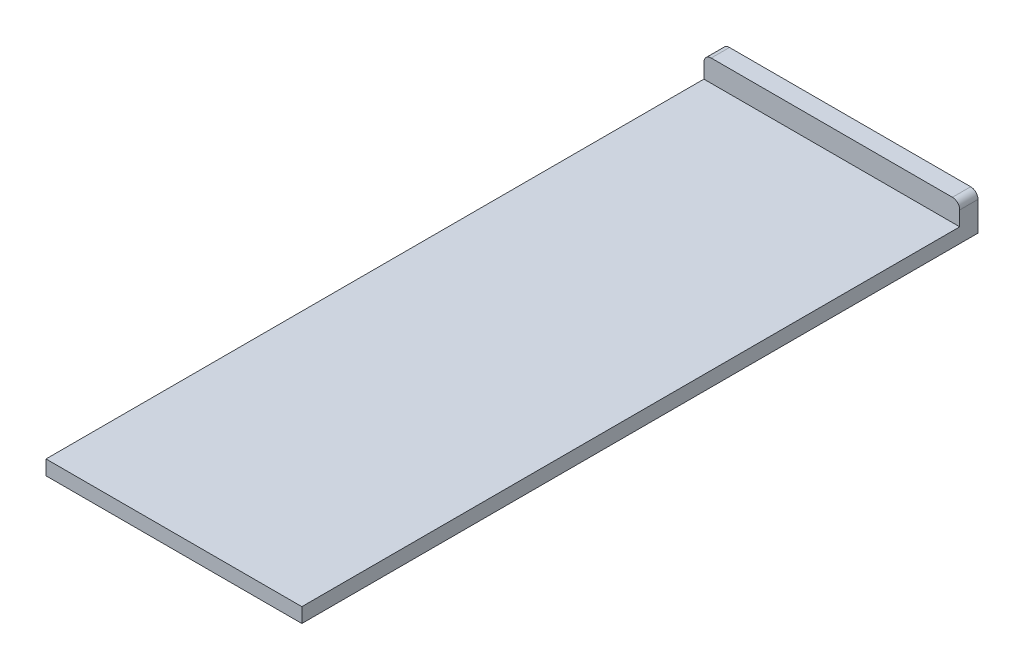
ISO-10303-21;
HEADER;
FILE_DESCRIPTION(('STEP AP214'),'2;1');
FILE_NAME('part.step','',(''),(''),'','','');
FILE_SCHEMA(('AUTOMOTIVE_DESIGN { 1 0 10303 214 1 1 1 1 }'));
ENDSEC;
DATA;
#1=APPLICATION_CONTEXT('core data for automotive mechanical design processes');
#2=APPLICATION_PROTOCOL_DEFINITION('international standard','automotive_design',2000,#1);
#3=PRODUCT_CONTEXT('',#1,'mechanical');
#4=PRODUCT('Part','Part','',(#3));
#5=PRODUCT_RELATED_PRODUCT_CATEGORY('part','',(#4));
#6=PRODUCT_DEFINITION_FORMATION('','',#4);
#7=PRODUCT_DEFINITION_CONTEXT('part definition',#1,'design');
#8=PRODUCT_DEFINITION('design','',#6,#7);
#9=PRODUCT_DEFINITION_SHAPE('','',#8);
#10=(LENGTH_UNIT() NAMED_UNIT(*) SI_UNIT(.MILLI.,.METRE.));
#11=(NAMED_UNIT(*) PLANE_ANGLE_UNIT() SI_UNIT($,.RADIAN.));
#12=(NAMED_UNIT(*) SI_UNIT($,.STERADIAN.) SOLID_ANGLE_UNIT());
#13=UNCERTAINTY_MEASURE_WITH_UNIT(LENGTH_MEASURE(1.E-05),#10,'distance_accuracy_value','');
#14=(GEOMETRIC_REPRESENTATION_CONTEXT(3) GLOBAL_UNCERTAINTY_ASSIGNED_CONTEXT((#13)) GLOBAL_UNIT_ASSIGNED_CONTEXT((#10,
#11,#12)) REPRESENTATION_CONTEXT('',''));
#15=CARTESIAN_POINT('',(0.,0.,0.));
#16=DIRECTION('',(0.,0.,1.));
#17=DIRECTION('',(1.,0.,0.));
#18=AXIS2_PLACEMENT_3D('',#15,#16,#17);
#19=CARTESIAN_POINT('',(43.9882449197725,0.,6.35));
#20=DIRECTION('',(1.,0.,0.));
#21=DIRECTION('',(0.,0.,-1.));
#22=AXIS2_PLACEMENT_3D('',#19,#20,#21);
#23=PLANE('',#22);
#24=DIRECTION('',(0.,0.,-1.));
#25=VECTOR('',#24,1.);
#26=CARTESIAN_POINT('',(43.9882449197725,0.126999999999996,6.35));
#27=LINE('',#26,#25);
#28=CARTESIAN_POINT('',(43.9882449197725,0.126999999999996,234.95));
#29=VERTEX_POINT('',#28);
#30=CARTESIAN_POINT('',(43.9882449197725,0.126999999999996,0.));
#31=VERTEX_POINT('',#30);
#32=EDGE_CURVE('E166',#29,#31,#27,.T.);
#33=ORIENTED_EDGE('',*,*,#32,.T.);
#34=DIRECTION('',(0.,-1.,0.));
#35=VECTOR('',#34,1.);
#36=CARTESIAN_POINT('',(43.9882449197725,0.,0.));
#37=LINE('',#36,#35);
#38=CARTESIAN_POINT('',(43.9882449197725,10.287,0.));
#39=VERTEX_POINT('',#38);
#40=EDGE_CURVE('E100',#39,#31,#37,.T.);
#41=ORIENTED_EDGE('',*,*,#40,.F.);
#42=DIRECTION('',(0.,0.,-1.));
#43=VECTOR('',#42,1.);
#44=CARTESIAN_POINT('',(43.9882449197725,10.287,6.35));
#45=LINE('',#44,#43);
#46=CARTESIAN_POINT('',(43.9882449197725,10.287,6.35));
#47=VERTEX_POINT('',#46);
#48=EDGE_CURVE('E54',#47,#39,#45,.T.);
#49=ORIENTED_EDGE('',*,*,#48,.F.);
#50=DIRECTION('',(0.,-1.,0.));
#51=VECTOR('',#50,1.);
#52=CARTESIAN_POINT('',(43.9882449197725,0.,6.35));
#53=LINE('',#52,#51);
#54=CARTESIAN_POINT('',(43.9882449197725,5.207,6.35));
#55=VERTEX_POINT('',#54);
#56=EDGE_CURVE('E155',#47,#55,#53,.T.);
#57=ORIENTED_EDGE('',*,*,#56,.T.);
#58=DIRECTION('',(0.,0.,-1.));
#59=VECTOR('',#58,1.);
#60=CARTESIAN_POINT('',(43.9882449197725,5.207,234.95));
#61=LINE('',#60,#59);
#62=CARTESIAN_POINT('',(43.9882449197725,5.207,234.95));
#63=VERTEX_POINT('',#62);
#64=EDGE_CURVE('E130',#63,#55,#61,.T.);
#65=ORIENTED_EDGE('',*,*,#64,.F.);
#66=DIRECTION('',(0.,-1.,0.));
#67=VECTOR('',#66,1.);
#68=CARTESIAN_POINT('',(43.9882449197725,0.,234.95));
#69=LINE('',#68,#67);
#70=EDGE_CURVE('E138',#63,#29,#69,.T.);
#71=ORIENTED_EDGE('',*,*,#70,.T.);
#72=EDGE_LOOP('',(#33,#41,#49,#57,#65,#71));
#73=FACE_BOUND('',#72,.T.);
#74=ADVANCED_FACE('F50',(#73),#23,.T.);
#75=CARTESIAN_POINT('',(41.4482449197725,10.287,6.35));
#76=DIRECTION('',(0.,0.,-1.));
#77=DIRECTION('',(-1.,0.,0.));
#78=AXIS2_PLACEMENT_3D('',#75,#76,#77);
#79=CYLINDRICAL_SURFACE('',#78,2.54);
#80=CARTESIAN_POINT('',(41.4482449197725,10.287,0.));
#81=DIRECTION('',(0.,0.,1.));
#82=DIRECTION('',(1.,0.,0.));
#83=AXIS2_PLACEMENT_3D('',#80,#81,#82);
#84=CIRCLE('',#83,2.54);
#85=CARTESIAN_POINT('',(41.4482449197725,12.827,0.));
#86=VERTEX_POINT('',#85);
#87=EDGE_CURVE('E171',#39,#86,#84,.T.);
#88=ORIENTED_EDGE('',*,*,#87,.T.);
#89=DIRECTION('',(0.,0.,-1.));
#90=VECTOR('',#89,1.);
#91=CARTESIAN_POINT('',(41.4482449197725,12.827,6.35));
#92=LINE('',#91,#90);
#93=CARTESIAN_POINT('',(41.4482449197725,12.827,6.35));
#94=VERTEX_POINT('',#93);
#95=EDGE_CURVE('E200',#94,#86,#92,.T.);
#96=ORIENTED_EDGE('',*,*,#95,.F.);
#97=CARTESIAN_POINT('',(41.4482449197725,10.287,6.35));
#98=DIRECTION('',(0.,0.,1.));
#99=DIRECTION('',(1.,0.,0.));
#100=AXIS2_PLACEMENT_3D('',#97,#98,#99);
#101=CIRCLE('',#100,2.54);
#102=EDGE_CURVE('E154',#47,#94,#101,.T.);
#103=ORIENTED_EDGE('',*,*,#102,.F.);
#104=ORIENTED_EDGE('',*,*,#48,.T.);
#105=EDGE_LOOP('',(#88,#96,#103,#104));
#106=FACE_BOUND('',#105,.T.);
#107=ADVANCED_FACE('F201',(#106),#79,.T.);
#108=CARTESIAN_POINT('',(0.,12.827,6.35));
#109=DIRECTION('',(0.,1.,0.));
#110=DIRECTION('',(0.,0.,1.));
#111=AXIS2_PLACEMENT_3D('',#108,#109,#110);
#112=PLANE('',#111);
#113=DIRECTION('',(1.,0.,0.));
#114=VECTOR('',#113,1.);
#115=CARTESIAN_POINT('',(0.,12.827,0.));
#116=LINE('',#115,#114);
#117=CARTESIAN_POINT('',(-42.3717550802275,12.827,0.));
#118=VERTEX_POINT('',#117);
#119=EDGE_CURVE('E178',#118,#86,#116,.T.);
#120=ORIENTED_EDGE('',*,*,#119,.F.);
#121=DIRECTION('',(0.,0.,-1.));
#122=VECTOR('',#121,1.);
#123=CARTESIAN_POINT('',(-42.3717550802275,12.827,6.35));
#124=LINE('',#123,#122);
#125=CARTESIAN_POINT('',(-42.3717550802275,12.827,6.35));
#126=VERTEX_POINT('',#125);
#127=EDGE_CURVE('E198',#126,#118,#124,.T.);
#128=ORIENTED_EDGE('',*,*,#127,.F.);
#129=DIRECTION('',(1.,0.,0.));
#130=VECTOR('',#129,1.);
#131=CARTESIAN_POINT('',(0.,12.827,6.35));
#132=LINE('',#131,#130);
#133=EDGE_CURVE('E157',#126,#94,#132,.T.);
#134=ORIENTED_EDGE('',*,*,#133,.T.);
#135=ORIENTED_EDGE('',*,*,#95,.T.);
#136=EDGE_LOOP('',(#120,#128,#134,#135));
#137=FACE_BOUND('',#136,.T.);
#138=ADVANCED_FACE('F216',(#137),#112,.T.);
#139=CARTESIAN_POINT('',(-42.3717550802275,10.287,6.35));
#140=DIRECTION('',(0.,0.,-1.));
#141=DIRECTION('',(-1.,0.,0.));
#142=AXIS2_PLACEMENT_3D('',#139,#140,#141);
#143=CYLINDRICAL_SURFACE('',#142,2.54);
#144=CARTESIAN_POINT('',(-42.3717550802275,10.287,0.));
#145=DIRECTION('',(0.,0.,1.));
#146=DIRECTION('',(1.,0.,0.));
#147=AXIS2_PLACEMENT_3D('',#144,#145,#146);
#148=CIRCLE('',#147,2.54);
#149=CARTESIAN_POINT('',(-44.9117550802275,10.287,0.));
#150=VERTEX_POINT('',#149);
#151=EDGE_CURVE('E177',#150,#118,#148,.F.);
#152=ORIENTED_EDGE('',*,*,#151,.F.);
#153=DIRECTION('',(0.,0.,-1.));
#154=VECTOR('',#153,1.);
#155=CARTESIAN_POINT('',(-44.9117550802275,10.287,6.35));
#156=LINE('',#155,#154);
#157=CARTESIAN_POINT('',(-44.9117550802275,10.287,6.35));
#158=VERTEX_POINT('',#157);
#159=EDGE_CURVE('E191',#158,#150,#156,.T.);
#160=ORIENTED_EDGE('',*,*,#159,.F.);
#161=CARTESIAN_POINT('',(-42.3717550802275,10.287,6.35));
#162=DIRECTION('',(0.,0.,1.));
#163=DIRECTION('',(1.,0.,0.));
#164=AXIS2_PLACEMENT_3D('',#161,#162,#163);
#165=CIRCLE('',#164,2.54);
#166=EDGE_CURVE('E162',#158,#126,#165,.F.);
#167=ORIENTED_EDGE('',*,*,#166,.T.);
#168=ORIENTED_EDGE('',*,*,#127,.T.);
#169=EDGE_LOOP('',(#152,#160,#167,#168));
#170=FACE_BOUND('',#169,.T.);
#171=ADVANCED_FACE('F213',(#170),#143,.T.);
#172=CARTESIAN_POINT('',(-44.9117550802275,0.,6.35));
#173=DIRECTION('',(-1.,0.,0.));
#174=DIRECTION('',(0.,0.,1.));
#175=AXIS2_PLACEMENT_3D('',#172,#173,#174);
#176=PLANE('',#175);
#177=ORIENTED_EDGE('',*,*,#159,.T.);
#178=DIRECTION('',(0.,1.,0.));
#179=VECTOR('',#178,1.);
#180=CARTESIAN_POINT('',(-44.9117550802275,0.,0.));
#181=LINE('',#180,#179);
#182=CARTESIAN_POINT('',(-44.9117550802275,0.126999999999996,0.));
#183=VERTEX_POINT('',#182);
#184=EDGE_CURVE('E184',#183,#150,#181,.T.);
#185=ORIENTED_EDGE('',*,*,#184,.F.);
#186=DIRECTION('',(0.,0.,-1.));
#187=VECTOR('',#186,1.);
#188=CARTESIAN_POINT('',(-44.9117550802275,0.126999999999996,6.35));
#189=LINE('',#188,#187);
#190=CARTESIAN_POINT('',(-44.9117550802275,0.126999999999996,234.95));
#191=VERTEX_POINT('',#190);
#192=EDGE_CURVE('E143',#191,#183,#189,.T.);
#193=ORIENTED_EDGE('',*,*,#192,.F.);
#194=DIRECTION('',(0.,1.,0.));
#195=VECTOR('',#194,1.);
#196=CARTESIAN_POINT('',(-44.9117550802275,0.,234.95));
#197=LINE('',#196,#195);
#198=CARTESIAN_POINT('',(-44.9117550802275,5.207,234.95));
#199=VERTEX_POINT('',#198);
#200=EDGE_CURVE('E135',#191,#199,#197,.T.);
#201=ORIENTED_EDGE('',*,*,#200,.T.);
#202=DIRECTION('',(0.,0.,-1.));
#203=VECTOR('',#202,1.);
#204=CARTESIAN_POINT('',(-44.9117550802275,5.207,234.95));
#205=LINE('',#204,#203);
#206=CARTESIAN_POINT('',(-44.9117550802275,5.207,6.34999999999999));
#207=VERTEX_POINT('',#206);
#208=EDGE_CURVE('E118',#199,#207,#205,.T.);
#209=ORIENTED_EDGE('',*,*,#208,.T.);
#210=DIRECTION('',(0.,1.,0.));
#211=VECTOR('',#210,1.);
#212=CARTESIAN_POINT('',(-44.9117550802275,0.,6.35));
#213=LINE('',#212,#211);
#214=EDGE_CURVE('E66',#207,#158,#213,.T.);
#215=ORIENTED_EDGE('',*,*,#214,.T.);
#216=EDGE_LOOP('',(#177,#185,#193,#201,#209,#215));
#217=FACE_BOUND('',#216,.T.);
#218=ADVANCED_FACE('F139',(#217),#176,.T.);
#219=CARTESIAN_POINT('',(0.,0.126999999999996,6.35));
#220=DIRECTION('',(0.,-1.,0.));
#221=DIRECTION('',(1.,0.,0.));
#222=AXIS2_PLACEMENT_3D('',#219,#220,#221);
#223=PLANE('',#222);
#224=DIRECTION('',(-1.,0.,0.));
#225=VECTOR('',#224,1.);
#226=CARTESIAN_POINT('',(0.,0.126999999999996,0.));
#227=LINE('',#226,#225);
#228=EDGE_CURVE('E156',#31,#183,#227,.T.);
#229=ORIENTED_EDGE('',*,*,#228,.F.);
#230=ORIENTED_EDGE('',*,*,#32,.F.);
#231=DIRECTION('',(-1.,0.,0.));
#232=VECTOR('',#231,1.);
#233=CARTESIAN_POINT('',(0.,0.126999999999996,234.95));
#234=LINE('',#233,#232);
#235=EDGE_CURVE('E141',#29,#191,#234,.T.);
#236=ORIENTED_EDGE('',*,*,#235,.T.);
#237=ORIENTED_EDGE('',*,*,#192,.T.);
#238=EDGE_LOOP('',(#229,#230,#236,#237));
#239=FACE_BOUND('',#238,.T.);
#240=ADVANCED_FACE('F207',(#239),#223,.T.);
#241=CARTESIAN_POINT('',(0.,0.,6.35));
#242=DIRECTION('',(0.,0.,1.));
#243=DIRECTION('',(1.,0.,0.));
#244=AXIS2_PLACEMENT_3D('',#241,#242,#243);
#245=PLANE('',#244);
#246=DIRECTION('',(-1.,0.,0.));
#247=VECTOR('',#246,1.);
#248=CARTESIAN_POINT('',(0.,5.207,6.35));
#249=LINE('',#248,#247);
#250=EDGE_CURVE('E11',#55,#207,#249,.T.);
#251=ORIENTED_EDGE('',*,*,#250,.F.);
#252=ORIENTED_EDGE('',*,*,#56,.F.);
#253=ORIENTED_EDGE('',*,*,#102,.T.);
#254=ORIENTED_EDGE('',*,*,#133,.F.);
#255=ORIENTED_EDGE('',*,*,#166,.F.);
#256=ORIENTED_EDGE('',*,*,#214,.F.);
#257=EDGE_LOOP('',(#251,#252,#253,#254,#255,#256));
#258=FACE_BOUND('',#257,.T.);
#259=ADVANCED_FACE('F220',(#258),#245,.T.);
#260=CARTESIAN_POINT('',(0.,0.,0.));
#261=DIRECTION('',(0.,0.,1.));
#262=DIRECTION('',(1.,0.,0.));
#263=AXIS2_PLACEMENT_3D('',#260,#261,#262);
#264=PLANE('',#263);
#265=ORIENTED_EDGE('',*,*,#184,.T.);
#266=ORIENTED_EDGE('',*,*,#151,.T.);
#267=ORIENTED_EDGE('',*,*,#119,.T.);
#268=ORIENTED_EDGE('',*,*,#87,.F.);
#269=ORIENTED_EDGE('',*,*,#40,.T.);
#270=ORIENTED_EDGE('',*,*,#228,.T.);
#271=EDGE_LOOP('',(#265,#266,#267,#268,#269,#270));
#272=FACE_BOUND('',#271,.T.);
#273=ADVANCED_FACE('F202',(#272),#264,.F.);
#274=CARTESIAN_POINT('',(0.,5.207,234.95));
#275=DIRECTION('',(0.,1.,0.));
#276=DIRECTION('',(0.,0.,1.));
#277=AXIS2_PLACEMENT_3D('',#274,#275,#276);
#278=PLANE('',#277);
#279=ORIENTED_EDGE('',*,*,#64,.T.);
#280=ORIENTED_EDGE('',*,*,#250,.T.);
#281=ORIENTED_EDGE('',*,*,#208,.F.);
#282=DIRECTION('',(1.,0.,0.));
#283=VECTOR('',#282,1.);
#284=CARTESIAN_POINT('',(0.,5.207,234.95));
#285=LINE('',#284,#283);
#286=EDGE_CURVE('E121',#199,#63,#285,.T.);
#287=ORIENTED_EDGE('',*,*,#286,.T.);
#288=EDGE_LOOP('',(#279,#280,#281,#287));
#289=FACE_BOUND('',#288,.T.);
#290=ADVANCED_FACE('F125',(#289),#278,.T.);
#291=CARTESIAN_POINT('',(0.,0.,234.95));
#292=DIRECTION('',(0.,0.,1.));
#293=DIRECTION('',(1.,0.,0.));
#294=AXIS2_PLACEMENT_3D('',#291,#292,#293);
#295=PLANE('',#294);
#296=ORIENTED_EDGE('',*,*,#286,.F.);
#297=ORIENTED_EDGE('',*,*,#200,.F.);
#298=ORIENTED_EDGE('',*,*,#235,.F.);
#299=ORIENTED_EDGE('',*,*,#70,.F.);
#300=EDGE_LOOP('',(#296,#297,#298,#299));
#301=FACE_BOUND('',#300,.T.);
#302=ADVANCED_FACE('F134',(#301),#295,.T.);
#303=CLOSED_SHELL('',(#74,#107,#138,#171,#218,#240,#259,#273,#290,#302));
#304=MANIFOLD_SOLID_BREP('B2',#303);
#305=ADVANCED_BREP_SHAPE_REPRESENTATION('',(#18,#304),#14);
#306=SHAPE_DEFINITION_REPRESENTATION(#9,#305);
ENDSEC;
END-ISO-10303-21;
